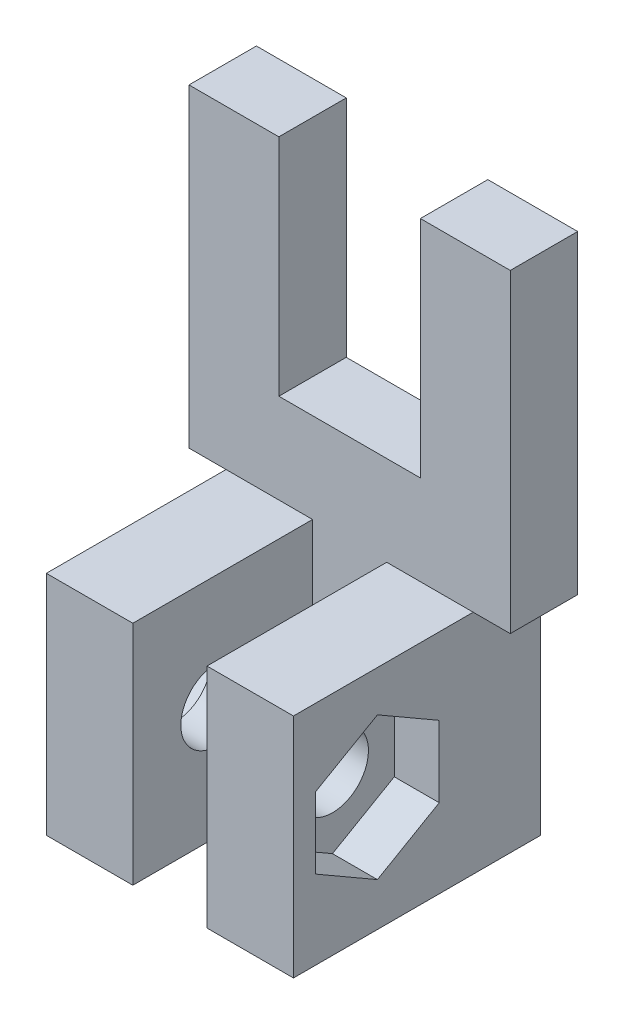
ISO-10303-21;
HEADER;
FILE_DESCRIPTION(('STEP AP214'),'2;1');
FILE_NAME('part.step','',(''),(''),'','','');
FILE_SCHEMA(('AUTOMOTIVE_DESIGN { 1 0 10303 214 1 1 1 1 }'));
ENDSEC;
DATA;
#1=APPLICATION_CONTEXT('core data for automotive mechanical design processes');
#2=APPLICATION_PROTOCOL_DEFINITION('international standard','automotive_design',2000,#1);
#3=PRODUCT_CONTEXT('',#1,'mechanical');
#4=PRODUCT('Part','Part','',(#3));
#5=PRODUCT_RELATED_PRODUCT_CATEGORY('part','',(#4));
#6=PRODUCT_DEFINITION_FORMATION('','',#4);
#7=PRODUCT_DEFINITION_CONTEXT('part definition',#1,'design');
#8=PRODUCT_DEFINITION('design','',#6,#7);
#9=PRODUCT_DEFINITION_SHAPE('','',#8);
#10=(LENGTH_UNIT() NAMED_UNIT(*) SI_UNIT(.MILLI.,.METRE.));
#11=(NAMED_UNIT(*) PLANE_ANGLE_UNIT() SI_UNIT($,.RADIAN.));
#12=(NAMED_UNIT(*) SI_UNIT($,.STERADIAN.) SOLID_ANGLE_UNIT());
#13=UNCERTAINTY_MEASURE_WITH_UNIT(LENGTH_MEASURE(1.E-05),#10,'distance_accuracy_value','');
#14=(GEOMETRIC_REPRESENTATION_CONTEXT(3) GLOBAL_UNCERTAINTY_ASSIGNED_CONTEXT((#13)) GLOBAL_UNIT_ASSIGNED_CONTEXT((#10,
#11,#12)) REPRESENTATION_CONTEXT('',''));
#15=CARTESIAN_POINT('',(0.,0.,0.));
#16=DIRECTION('',(0.,0.,1.));
#17=DIRECTION('',(1.,0.,0.));
#18=AXIS2_PLACEMENT_3D('',#15,#16,#17);
#19=CARTESIAN_POINT('',(-1.38691141904346E-12,-9.88835921456923,3.));
#20=DIRECTION('',(-1.,0.,0.));
#21=DIRECTION('',(0.,-1.,0.));
#22=AXIS2_PLACEMENT_3D('',#19,#20,#21);
#23=PLANE('',#22);
#24=DIRECTION('',(0.,1.,0.));
#25=VECTOR('',#24,1.);
#26=CARTESIAN_POINT('',(-1.38691141904346E-12,-9.88835921456923,0.));
#27=LINE('',#26,#25);
#28=CARTESIAN_POINT('',(0.,0.,0.));
#29=VERTEX_POINT('',#28);
#30=CARTESIAN_POINT('',(0.,10.1,0.));
#31=VERTEX_POINT('',#30);
#32=EDGE_CURVE('E396',#29,#31,#27,.T.);
#33=ORIENTED_EDGE('',*,*,#32,.F.);
#34=DIRECTION('',(0.,0.,-1.));
#35=VECTOR('',#34,1.);
#36=CARTESIAN_POINT('',(0.,0.,3.));
#37=LINE('',#36,#35);
#38=CARTESIAN_POINT('',(0.,0.,11.));
#39=VERTEX_POINT('',#38);
#40=EDGE_CURVE('E11',#39,#29,#37,.T.);
#41=ORIENTED_EDGE('',*,*,#40,.F.);
#42=DIRECTION('',(0.,-1.,0.));
#43=VECTOR('',#42,1.);
#44=CARTESIAN_POINT('',(0.,10.1,11.));
#45=LINE('',#44,#43);
#46=CARTESIAN_POINT('',(0.,10.1,11.));
#47=VERTEX_POINT('',#46);
#48=EDGE_CURVE('E341',#47,#39,#45,.T.);
#49=ORIENTED_EDGE('',*,*,#48,.F.);
#50=DIRECTION('',(0.,0.,-1.));
#51=VECTOR('',#50,1.);
#52=CARTESIAN_POINT('',(0.,10.1,11.));
#53=LINE('',#52,#51);
#54=CARTESIAN_POINT('',(0.,10.1,3.));
#55=VERTEX_POINT('',#54);
#56=EDGE_CURVE('E351',#47,#55,#53,.T.);
#57=ORIENTED_EDGE('',*,*,#56,.T.);
#58=DIRECTION('',(0.,0.,-1.));
#59=VECTOR('',#58,1.);
#60=CARTESIAN_POINT('',(0.,10.1,3.));
#61=LINE('',#60,#59);
#62=EDGE_CURVE('E430',#55,#31,#61,.T.);
#63=ORIENTED_EDGE('',*,*,#62,.T.);
#64=EDGE_LOOP('',(#33,#41,#49,#57,#63));
#65=FACE_BOUND('',#64,.T.);
#66=DIRECTION('',(0.,1.,0.));
#67=VECTOR('',#66,1.);
#68=CARTESIAN_POINT('',(0.,3.51228675972852,4.51346876245897));
#69=LINE('',#68,#67);
#70=CARTESIAN_POINT('',(0.,3.51228675972852,4.51346876245897));
#71=VERTEX_POINT('',#70);
#72=CARTESIAN_POINT('',(-2.36715337967284E-13,6.68771324027147,4.51346876245897));
#73=VERTEX_POINT('',#72);
#74=EDGE_CURVE('E266',#71,#73,#69,.T.);
#75=ORIENTED_EDGE('',*,*,#74,.T.);
#76=DIRECTION('',(0.,0.5,0.866025403784439));
#77=VECTOR('',#76,1.);
#78=CARTESIAN_POINT('',(0.,6.68771324027147,4.51346876245897));
#79=LINE('',#78,#77);
#80=CARTESIAN_POINT('',(0.,8.27542648054294,7.26346876245897));
#81=VERTEX_POINT('',#80);
#82=EDGE_CURVE('E54',#73,#81,#79,.T.);
#83=ORIENTED_EDGE('',*,*,#82,.T.);
#84=DIRECTION('',(0.,-0.5,0.866025403784438));
#85=VECTOR('',#84,1.);
#86=CARTESIAN_POINT('',(0.,8.27542648054294,7.26346876245897));
#87=LINE('',#86,#85);
#88=CARTESIAN_POINT('',(0.,6.68771324027147,10.013468762459));
#89=VERTEX_POINT('',#88);
#90=EDGE_CURVE('E251',#81,#89,#87,.T.);
#91=ORIENTED_EDGE('',*,*,#90,.T.);
#92=DIRECTION('',(0.,-1.,0.));
#93=VECTOR('',#92,1.);
#94=CARTESIAN_POINT('',(0.,6.68771324027147,10.013468762459));
#95=LINE('',#94,#93);
#96=CARTESIAN_POINT('',(0.,3.51228675972852,10.013468762459));
#97=VERTEX_POINT('',#96);
#98=EDGE_CURVE('E254',#89,#97,#95,.T.);
#99=ORIENTED_EDGE('',*,*,#98,.T.);
#100=DIRECTION('',(0.,-0.5,-0.866025403784439));
#101=VECTOR('',#100,1.);
#102=CARTESIAN_POINT('',(0.,3.51228675972852,10.013468762459));
#103=LINE('',#102,#101);
#104=CARTESIAN_POINT('',(0.,1.92457351945705,7.26346876245897));
#105=VERTEX_POINT('',#104);
#106=EDGE_CURVE('E271',#97,#105,#103,.T.);
#107=ORIENTED_EDGE('',*,*,#106,.T.);
#108=DIRECTION('',(0.,0.5,-0.866025403784438));
#109=VECTOR('',#108,1.);
#110=CARTESIAN_POINT('',(0.,1.92457351945705,7.26346876245897));
#111=LINE('',#110,#109);
#112=EDGE_CURVE('E268',#105,#71,#111,.T.);
#113=ORIENTED_EDGE('',*,*,#112,.T.);
#114=EDGE_LOOP('',(#75,#83,#91,#99,#107,#113));
#115=FACE_BOUND('',#114,.T.);
#116=ADVANCED_FACE('F37',(#65,#115),#23,.T.);
#117=CARTESIAN_POINT('',(12.651,5.09999999999999,7.26346876245897));
#118=DIRECTION('',(-1.,0.,0.));
#119=DIRECTION('',(0.,0.,1.));
#120=AXIS2_PLACEMENT_3D('',#117,#118,#119);
#121=CYLINDRICAL_SURFACE('',#120,1.6);
#122=CARTESIAN_POINT('',(3.85,5.09999999999999,7.26346876245897));
#123=DIRECTION('',(-1.,0.,0.));
#124=DIRECTION('',(0.,0.,1.));
#125=AXIS2_PLACEMENT_3D('',#122,#123,#124);
#126=CIRCLE('',#125,1.6);
#127=CARTESIAN_POINT('',(3.85,5.09999999999999,8.86346876245897));
#128=VERTEX_POINT('',#127);
#129=EDGE_CURVE('E278',#128,#128,#126,.T.);
#130=ORIENTED_EDGE('',*,*,#129,.F.);
#131=EDGE_LOOP('',(#130));
#132=FACE_BOUND('',#131,.T.);
#133=CARTESIAN_POINT('',(2.,5.09999999999999,7.26346876245897));
#134=DIRECTION('',(1.,0.,0.));
#135=DIRECTION('',(0.,1.,0.));
#136=AXIS2_PLACEMENT_3D('',#133,#134,#135);
#137=CIRCLE('',#136,1.6);
#138=CARTESIAN_POINT('',(2.,6.69999999999999,7.26346876245897));
#139=VERTEX_POINT('',#138);
#140=EDGE_CURVE('E257',#139,#139,#137,.T.);
#141=ORIENTED_EDGE('',*,*,#140,.F.);
#142=EDGE_LOOP('',(#141));
#143=FACE_BOUND('',#142,.T.);
#144=ADVANCED_FACE('F564',(#132,#143),#121,.F.);
#145=CARTESIAN_POINT('',(3.85,10.1,11.));
#146=DIRECTION('',(-1.,0.,0.));
#147=DIRECTION('',(0.,0.,1.));
#148=AXIS2_PLACEMENT_3D('',#145,#146,#147);
#149=PLANE('',#148);
#150=DIRECTION('',(0.,1.,0.));
#151=VECTOR('',#150,1.);
#152=CARTESIAN_POINT('',(3.85,10.1,3.));
#153=LINE('',#152,#151);
#154=CARTESIAN_POINT('',(3.85,0.,3.));
#155=VERTEX_POINT('',#154);
#156=CARTESIAN_POINT('',(3.85,10.1,3.));
#157=VERTEX_POINT('',#156);
#158=EDGE_CURVE('E340',#155,#157,#153,.T.);
#159=ORIENTED_EDGE('',*,*,#158,.T.);
#160=DIRECTION('',(0.,0.,-1.));
#161=VECTOR('',#160,1.);
#162=CARTESIAN_POINT('',(3.85,10.1,11.));
#163=LINE('',#162,#161);
#164=CARTESIAN_POINT('',(3.85,10.1,11.));
#165=VERTEX_POINT('',#164);
#166=EDGE_CURVE('E357',#165,#157,#163,.T.);
#167=ORIENTED_EDGE('',*,*,#166,.F.);
#168=DIRECTION('',(0.,1.,0.));
#169=VECTOR('',#168,1.);
#170=CARTESIAN_POINT('',(3.85,10.1,11.));
#171=LINE('',#170,#169);
#172=CARTESIAN_POINT('',(3.85,0.,11.));
#173=VERTEX_POINT('',#172);
#174=EDGE_CURVE('E347',#173,#165,#171,.T.);
#175=ORIENTED_EDGE('',*,*,#174,.F.);
#176=DIRECTION('',(0.,0.,-1.));
#177=VECTOR('',#176,1.);
#178=CARTESIAN_POINT('',(3.85,0.,11.));
#179=LINE('',#178,#177);
#180=EDGE_CURVE('E359',#173,#155,#179,.T.);
#181=ORIENTED_EDGE('',*,*,#180,.T.);
#182=EDGE_LOOP('',(#159,#167,#175,#181));
#183=FACE_BOUND('',#182,.T.);
#184=ORIENTED_EDGE('',*,*,#129,.T.);
#185=EDGE_LOOP('',(#184));
#186=FACE_BOUND('',#185,.T.);
#187=ADVANCED_FACE('F546',(#183,#186),#149,.F.);
#188=CARTESIAN_POINT('',(-1.65100000000002,5.1,7.26346876245897));
#189=DIRECTION('',(1.,0.,0.));
#190=DIRECTION('',(0.,1.,0.));
#191=AXIS2_PLACEMENT_3D('',#188,#189,#190);
#192=CYLINDRICAL_SURFACE('',#191,1.6);
#193=CARTESIAN_POINT('',(7.15,5.09999999999999,7.26346876245897));
#194=DIRECTION('',(1.,0.,0.));
#195=DIRECTION('',(0.,0.,-1.));
#196=AXIS2_PLACEMENT_3D('',#193,#194,#195);
#197=CIRCLE('',#196,1.6);
#198=CARTESIAN_POINT('',(7.15,5.09999999999999,5.66346876245897));
#199=VERTEX_POINT('',#198);
#200=EDGE_CURVE('E328',#199,#199,#197,.F.);
#201=ORIENTED_EDGE('',*,*,#200,.T.);
#202=EDGE_LOOP('',(#201));
#203=FACE_BOUND('',#202,.T.);
#204=CARTESIAN_POINT('',(9.,5.09999999999999,7.26346876245897));
#205=DIRECTION('',(1.,0.,0.));
#206=DIRECTION('',(0.,1.,0.));
#207=AXIS2_PLACEMENT_3D('',#204,#205,#206);
#208=CIRCLE('',#207,1.6);
#209=CARTESIAN_POINT('',(9.,6.69999999999999,7.26346876245897));
#210=VERTEX_POINT('',#209);
#211=EDGE_CURVE('E288',#210,#210,#208,.T.);
#212=ORIENTED_EDGE('',*,*,#211,.T.);
#213=EDGE_LOOP('',(#212));
#214=FACE_BOUND('',#213,.T.);
#215=ADVANCED_FACE('F573',(#203,#214),#192,.F.);
#216=CARTESIAN_POINT('',(5.49999999999999,-9.88835921456961,3.));
#217=DIRECTION('',(0.,0.,1.));
#218=DIRECTION('',(1.,0.,0.));
#219=AXIS2_PLACEMENT_3D('',#216,#217,#218);
#220=PLANE('',#219);
#221=DIRECTION('',(-1.,0.,0.));
#222=VECTOR('',#221,1.);
#223=CARTESIAN_POINT('',(0.,10.1,3.));
#224=LINE('',#223,#222);
#225=EDGE_CURVE('E345',#157,#55,#224,.T.);
#226=ORIENTED_EDGE('',*,*,#225,.F.);
#227=ORIENTED_EDGE('',*,*,#158,.F.);
#228=DIRECTION('',(1.,0.,0.));
#229=VECTOR('',#228,1.);
#230=CARTESIAN_POINT('',(5.49999999999999,0.,3.));
#231=LINE('',#230,#229);
#232=CARTESIAN_POINT('',(7.15,0.,3.));
#233=VERTEX_POINT('',#232);
#234=EDGE_CURVE('E40',#155,#233,#231,.T.);
#235=ORIENTED_EDGE('',*,*,#234,.T.);
#236=DIRECTION('',(0.,-1.,0.));
#237=VECTOR('',#236,1.);
#238=CARTESIAN_POINT('',(7.15,10.1,3.));
#239=LINE('',#238,#237);
#240=CARTESIAN_POINT('',(7.15,10.1,3.));
#241=VERTEX_POINT('',#240);
#242=EDGE_CURVE('E366',#241,#233,#239,.T.);
#243=ORIENTED_EDGE('',*,*,#242,.F.);
#244=DIRECTION('',(-1.,0.,0.));
#245=VECTOR('',#244,1.);
#246=CARTESIAN_POINT('',(11.,10.1,3.));
#247=LINE('',#246,#245);
#248=CARTESIAN_POINT('',(11.,10.1,3.));
#249=VERTEX_POINT('',#248);
#250=EDGE_CURVE('E361',#249,#241,#247,.T.);
#251=ORIENTED_EDGE('',*,*,#250,.F.);
#252=DIRECTION('',(-1.,0.,0.));
#253=VECTOR('',#252,1.);
#254=CARTESIAN_POINT('',(5.49999999999999,10.1,3.));
#255=LINE('',#254,#253);
#256=CARTESIAN_POINT('',(12.65,10.1,3.));
#257=VERTEX_POINT('',#256);
#258=EDGE_CURVE('E404',#257,#249,#255,.T.);
#259=ORIENTED_EDGE('',*,*,#258,.F.);
#260=DIRECTION('',(0.,-1.,0.));
#261=VECTOR('',#260,1.);
#262=CARTESIAN_POINT('',(12.65,-9.88835921456961,3.));
#263=LINE('',#262,#261);
#264=CARTESIAN_POINT('',(12.65,24.1,3.));
#265=VERTEX_POINT('',#264);
#266=EDGE_CURVE('E407',#265,#257,#263,.T.);
#267=ORIENTED_EDGE('',*,*,#266,.F.);
#268=DIRECTION('',(1.,0.,0.));
#269=VECTOR('',#268,1.);
#270=CARTESIAN_POINT('',(5.49999999999996,24.1,3.));
#271=LINE('',#270,#269);
#272=CARTESIAN_POINT('',(8.64999999999999,24.1,3.));
#273=VERTEX_POINT('',#272);
#274=EDGE_CURVE('E410',#273,#265,#271,.T.);
#275=ORIENTED_EDGE('',*,*,#274,.F.);
#276=DIRECTION('',(0.,1.,0.));
#277=VECTOR('',#276,1.);
#278=CARTESIAN_POINT('',(8.64999999999999,-9.88835921456961,3.));
#279=LINE('',#278,#277);
#280=CARTESIAN_POINT('',(8.64999999999999,14.1,3.));
#281=VERTEX_POINT('',#280);
#282=EDGE_CURVE('E413',#281,#273,#279,.T.);
#283=ORIENTED_EDGE('',*,*,#282,.F.);
#284=DIRECTION('',(1.,0.,0.));
#285=VECTOR('',#284,1.);
#286=CARTESIAN_POINT('',(5.49999999999999,14.1,3.));
#287=LINE('',#286,#285);
#288=CARTESIAN_POINT('',(2.34999999999999,14.1,3.));
#289=VERTEX_POINT('',#288);
#290=EDGE_CURVE('E416',#289,#281,#287,.T.);
#291=ORIENTED_EDGE('',*,*,#290,.F.);
#292=DIRECTION('',(0.,-1.,0.));
#293=VECTOR('',#292,1.);
#294=CARTESIAN_POINT('',(2.34999999999999,-9.88835921456961,3.));
#295=LINE('',#294,#293);
#296=CARTESIAN_POINT('',(2.34999999999999,24.1,3.));
#297=VERTEX_POINT('',#296);
#298=EDGE_CURVE('E419',#297,#289,#295,.T.);
#299=ORIENTED_EDGE('',*,*,#298,.F.);
#300=DIRECTION('',(1.,0.,0.));
#301=VECTOR('',#300,1.);
#302=CARTESIAN_POINT('',(5.50000000000002,24.1,3.));
#303=LINE('',#302,#301);
#304=CARTESIAN_POINT('',(-1.65000000000001,24.1,3.));
#305=VERTEX_POINT('',#304);
#306=EDGE_CURVE('E422',#305,#297,#303,.T.);
#307=ORIENTED_EDGE('',*,*,#306,.F.);
#308=DIRECTION('',(0.,1.,0.));
#309=VECTOR('',#308,1.);
#310=CARTESIAN_POINT('',(-1.65000000000001,-9.88835921456961,3.));
#311=LINE('',#310,#309);
#312=CARTESIAN_POINT('',(-1.65000000000001,10.1,3.));
#313=VERTEX_POINT('',#312);
#314=EDGE_CURVE('E425',#313,#305,#311,.T.);
#315=ORIENTED_EDGE('',*,*,#314,.F.);
#316=DIRECTION('',(-1.,0.,0.));
#317=VECTOR('',#316,1.);
#318=CARTESIAN_POINT('',(5.49999999999999,10.1,3.));
#319=LINE('',#318,#317);
#320=EDGE_CURVE('E428',#55,#313,#319,.T.);
#321=ORIENTED_EDGE('',*,*,#320,.F.);
#322=EDGE_LOOP('',(#226,#227,#235,#243,#251,#259,#267,#275,#283,#291,#299,#307,#315,#321));
#323=FACE_BOUND('',#322,.T.);
#324=ADVANCED_FACE('F499',(#323),#220,.T.);
#325=CARTESIAN_POINT('',(5.49999999999999,0.,3.));
#326=DIRECTION('',(0.,1.,0.));
#327=DIRECTION('',(0.,0.,1.));
#328=AXIS2_PLACEMENT_3D('',#325,#326,#327);
#329=PLANE('',#328);
#330=DIRECTION('',(1.,0.,0.));
#331=VECTOR('',#330,1.);
#332=CARTESIAN_POINT('',(5.49999999999999,0.,0.));
#333=LINE('',#332,#331);
#334=CARTESIAN_POINT('',(11.,0.,0.));
#335=VERTEX_POINT('',#334);
#336=EDGE_CURVE('E400',#29,#335,#333,.T.);
#337=ORIENTED_EDGE('',*,*,#336,.T.);
#338=DIRECTION('',(0.,0.,-1.));
#339=VECTOR('',#338,1.);
#340=CARTESIAN_POINT('',(11.,0.,3.));
#341=LINE('',#340,#339);
#342=CARTESIAN_POINT('',(11.,0.,11.));
#343=VERTEX_POINT('',#342);
#344=EDGE_CURVE('E46',#343,#335,#341,.T.);
#345=ORIENTED_EDGE('',*,*,#344,.F.);
#346=DIRECTION('',(1.,0.,0.));
#347=VECTOR('',#346,1.);
#348=CARTESIAN_POINT('',(11.,0.,11.));
#349=LINE('',#348,#347);
#350=CARTESIAN_POINT('',(7.15,0.,11.));
#351=VERTEX_POINT('',#350);
#352=EDGE_CURVE('E370',#351,#343,#349,.T.);
#353=ORIENTED_EDGE('',*,*,#352,.F.);
#354=DIRECTION('',(0.,0.,-1.));
#355=VECTOR('',#354,1.);
#356=CARTESIAN_POINT('',(7.15,0.,11.));
#357=LINE('',#356,#355);
#358=EDGE_CURVE('E373',#351,#233,#357,.T.);
#359=ORIENTED_EDGE('',*,*,#358,.T.);
#360=ORIENTED_EDGE('',*,*,#234,.F.);
#361=ORIENTED_EDGE('',*,*,#180,.F.);
#362=DIRECTION('',(1.,0.,0.));
#363=VECTOR('',#362,1.);
#364=CARTESIAN_POINT('',(0.,0.,11.));
#365=LINE('',#364,#363);
#366=EDGE_CURVE('E344',#39,#173,#365,.T.);
#367=ORIENTED_EDGE('',*,*,#366,.F.);
#368=ORIENTED_EDGE('',*,*,#40,.T.);
#369=EDGE_LOOP('',(#337,#345,#353,#359,#360,#361,#367,#368));
#370=FACE_BOUND('',#369,.T.);
#371=ADVANCED_FACE('F548',(#370),#329,.F.);
#372=CARTESIAN_POINT('',(11.,-9.88835921456962,3.));
#373=DIRECTION('',(-1.,0.,0.));
#374=DIRECTION('',(0.,-1.,0.));
#375=AXIS2_PLACEMENT_3D('',#372,#373,#374);
#376=PLANE('',#375);
#377=DIRECTION('',(0.,-0.5,0.866025403784438));
#378=VECTOR('',#377,1.);
#379=CARTESIAN_POINT('',(11.,8.27542648054293,7.26346876245897));
#380=LINE('',#379,#378);
#381=CARTESIAN_POINT('',(11.,8.27542648054294,7.26346876245897));
#382=VERTEX_POINT('',#381);
#383=CARTESIAN_POINT('',(11.,6.68771324027146,10.013468762459));
#384=VERTEX_POINT('',#383);
#385=EDGE_CURVE('E312',#382,#384,#380,.T.);
#386=ORIENTED_EDGE('',*,*,#385,.F.);
#387=DIRECTION('',(0.,0.5,0.866025403784439));
#388=VECTOR('',#387,1.);
#389=CARTESIAN_POINT('',(11.,6.68771324027146,4.51346876245897));
#390=LINE('',#389,#388);
#391=CARTESIAN_POINT('',(11.,6.68771324027146,4.51346876245897));
#392=VERTEX_POINT('',#391);
#393=EDGE_CURVE('E62',#392,#382,#390,.T.);
#394=ORIENTED_EDGE('',*,*,#393,.F.);
#395=DIRECTION('',(0.,1.,0.));
#396=VECTOR('',#395,1.);
#397=CARTESIAN_POINT('',(11.,3.51228675972852,4.51346876245897));
#398=LINE('',#397,#396);
#399=CARTESIAN_POINT('',(11.,3.51228675972852,4.51346876245897));
#400=VERTEX_POINT('',#399);
#401=EDGE_CURVE('E295',#400,#392,#398,.T.);
#402=ORIENTED_EDGE('',*,*,#401,.F.);
#403=DIRECTION('',(0.,0.5,-0.866025403784438));
#404=VECTOR('',#403,1.);
#405=CARTESIAN_POINT('',(11.,1.92457351945705,7.26346876245897));
#406=LINE('',#405,#404);
#407=CARTESIAN_POINT('',(11.,1.92457351945705,7.26346876245897));
#408=VERTEX_POINT('',#407);
#409=EDGE_CURVE('E321',#408,#400,#406,.T.);
#410=ORIENTED_EDGE('',*,*,#409,.F.);
#411=DIRECTION('',(0.,-0.5,-0.866025403784439));
#412=VECTOR('',#411,1.);
#413=CARTESIAN_POINT('',(11.,3.51228675972852,10.013468762459));
#414=LINE('',#413,#412);
#415=CARTESIAN_POINT('',(11.,3.51228675972852,10.013468762459));
#416=VERTEX_POINT('',#415);
#417=EDGE_CURVE('E318',#416,#408,#414,.T.);
#418=ORIENTED_EDGE('',*,*,#417,.F.);
#419=DIRECTION('',(0.,-1.,0.));
#420=VECTOR('',#419,1.);
#421=CARTESIAN_POINT('',(11.,6.68771324027146,10.013468762459));
#422=LINE('',#421,#420);
#423=EDGE_CURVE('E315',#384,#416,#422,.T.);
#424=ORIENTED_EDGE('',*,*,#423,.F.);
#425=EDGE_LOOP('',(#386,#394,#402,#410,#418,#424));
#426=FACE_BOUND('',#425,.T.);
#427=DIRECTION('',(0.,1.,0.));
#428=VECTOR('',#427,1.);
#429=CARTESIAN_POINT('',(11.,-9.88835921456962,0.));
#430=LINE('',#429,#428);
#431=CARTESIAN_POINT('',(11.,10.1,0.));
#432=VERTEX_POINT('',#431);
#433=EDGE_CURVE('E433',#335,#432,#430,.T.);
#434=ORIENTED_EDGE('',*,*,#433,.T.);
#435=DIRECTION('',(0.,0.,-1.));
#436=VECTOR('',#435,1.);
#437=CARTESIAN_POINT('',(11.,10.1,3.));
#438=LINE('',#437,#436);
#439=EDGE_CURVE('E480',#249,#432,#438,.T.);
#440=ORIENTED_EDGE('',*,*,#439,.F.);
#441=DIRECTION('',(0.,0.,-1.));
#442=VECTOR('',#441,1.);
#443=CARTESIAN_POINT('',(11.,10.1,11.));
#444=LINE('',#443,#442);
#445=CARTESIAN_POINT('',(11.,10.1,11.));
#446=VERTEX_POINT('',#445);
#447=EDGE_CURVE('E391',#446,#249,#444,.T.);
#448=ORIENTED_EDGE('',*,*,#447,.F.);
#449=DIRECTION('',(0.,1.,0.));
#450=VECTOR('',#449,1.);
#451=CARTESIAN_POINT('',(11.,10.1,11.));
#452=LINE('',#451,#450);
#453=EDGE_CURVE('E362',#343,#446,#452,.T.);
#454=ORIENTED_EDGE('',*,*,#453,.F.);
#455=ORIENTED_EDGE('',*,*,#344,.T.);
#456=EDGE_LOOP('',(#434,#440,#448,#454,#455));
#457=FACE_BOUND('',#456,.T.);
#458=ADVANCED_FACE('F485',(#426,#457),#376,.F.);
#459=CARTESIAN_POINT('',(5.49999999999999,10.1,3.));
#460=DIRECTION('',(0.,-1.,0.));
#461=DIRECTION('',(0.,0.,-1.));
#462=AXIS2_PLACEMENT_3D('',#459,#460,#461);
#463=PLANE('',#462);
#464=DIRECTION('',(-1.,0.,0.));
#465=VECTOR('',#464,1.);
#466=CARTESIAN_POINT('',(5.49999999999999,10.1,0.));
#467=LINE('',#466,#465);
#468=CARTESIAN_POINT('',(12.65,10.1,0.));
#469=VERTEX_POINT('',#468);
#470=EDGE_CURVE('E436',#469,#432,#467,.T.);
#471=ORIENTED_EDGE('',*,*,#470,.F.);
#472=DIRECTION('',(0.,0.,-1.));
#473=VECTOR('',#472,1.);
#474=CARTESIAN_POINT('',(12.65,10.1,3.));
#475=LINE('',#474,#473);
#476=EDGE_CURVE('E478',#257,#469,#475,.T.);
#477=ORIENTED_EDGE('',*,*,#476,.F.);
#478=ORIENTED_EDGE('',*,*,#258,.T.);
#479=ORIENTED_EDGE('',*,*,#439,.T.);
#480=EDGE_LOOP('',(#471,#477,#478,#479));
#481=FACE_BOUND('',#480,.T.);
#482=ADVANCED_FACE('F494',(#481),#463,.T.);
#483=CARTESIAN_POINT('',(12.65,-9.88835921456961,3.));
#484=DIRECTION('',(1.,0.,0.));
#485=DIRECTION('',(0.,0.,-1.));
#486=AXIS2_PLACEMENT_3D('',#483,#484,#485);
#487=PLANE('',#486);
#488=DIRECTION('',(0.,-1.,0.));
#489=VECTOR('',#488,1.);
#490=CARTESIAN_POINT('',(12.65,-9.88835921456961,0.));
#491=LINE('',#490,#489);
#492=CARTESIAN_POINT('',(12.65,24.1,0.));
#493=VERTEX_POINT('',#492);
#494=EDGE_CURVE('E439',#493,#469,#491,.T.);
#495=ORIENTED_EDGE('',*,*,#494,.F.);
#496=DIRECTION('',(0.,0.,-1.));
#497=VECTOR('',#496,1.);
#498=CARTESIAN_POINT('',(12.65,24.1,3.));
#499=LINE('',#498,#497);
#500=EDGE_CURVE('E476',#265,#493,#499,.T.);
#501=ORIENTED_EDGE('',*,*,#500,.F.);
#502=ORIENTED_EDGE('',*,*,#266,.T.);
#503=ORIENTED_EDGE('',*,*,#476,.T.);
#504=EDGE_LOOP('',(#495,#501,#502,#503));
#505=FACE_BOUND('',#504,.T.);
#506=ADVANCED_FACE('F502',(#505),#487,.T.);
#507=CARTESIAN_POINT('',(5.49999999999996,24.1,3.));
#508=DIRECTION('',(0.,1.,0.));
#509=DIRECTION('',(-1.,0.,0.));
#510=AXIS2_PLACEMENT_3D('',#507,#508,#509);
#511=PLANE('',#510);
#512=DIRECTION('',(1.,0.,0.));
#513=VECTOR('',#512,1.);
#514=CARTESIAN_POINT('',(5.49999999999996,24.1,0.));
#515=LINE('',#514,#513);
#516=CARTESIAN_POINT('',(8.64999999999999,24.1,0.));
#517=VERTEX_POINT('',#516);
#518=EDGE_CURVE('E442',#517,#493,#515,.T.);
#519=ORIENTED_EDGE('',*,*,#518,.F.);
#520=DIRECTION('',(0.,0.,-1.));
#521=VECTOR('',#520,1.);
#522=CARTESIAN_POINT('',(8.64999999999999,24.1,3.));
#523=LINE('',#522,#521);
#524=EDGE_CURVE('E474',#273,#517,#523,.T.);
#525=ORIENTED_EDGE('',*,*,#524,.F.);
#526=ORIENTED_EDGE('',*,*,#274,.T.);
#527=ORIENTED_EDGE('',*,*,#500,.T.);
#528=EDGE_LOOP('',(#519,#525,#526,#527));
#529=FACE_BOUND('',#528,.T.);
#530=ADVANCED_FACE('F505',(#529),#511,.T.);
#531=CARTESIAN_POINT('',(8.64999999999999,-9.88835921456961,3.));
#532=DIRECTION('',(-1.,0.,0.));
#533=DIRECTION('',(0.,0.,1.));
#534=AXIS2_PLACEMENT_3D('',#531,#532,#533);
#535=PLANE('',#534);
#536=DIRECTION('',(0.,1.,0.));
#537=VECTOR('',#536,1.);
#538=CARTESIAN_POINT('',(8.64999999999999,-9.88835921456961,0.));
#539=LINE('',#538,#537);
#540=CARTESIAN_POINT('',(8.64999999999999,14.1,0.));
#541=VERTEX_POINT('',#540);
#542=EDGE_CURVE('E445',#541,#517,#539,.T.);
#543=ORIENTED_EDGE('',*,*,#542,.F.);
#544=DIRECTION('',(0.,0.,-1.));
#545=VECTOR('',#544,1.);
#546=CARTESIAN_POINT('',(8.64999999999999,14.1,3.));
#547=LINE('',#546,#545);
#548=EDGE_CURVE('E472',#281,#541,#547,.T.);
#549=ORIENTED_EDGE('',*,*,#548,.F.);
#550=ORIENTED_EDGE('',*,*,#282,.T.);
#551=ORIENTED_EDGE('',*,*,#524,.T.);
#552=EDGE_LOOP('',(#543,#549,#550,#551));
#553=FACE_BOUND('',#552,.T.);
#554=ADVANCED_FACE('F510',(#553),#535,.T.);
#555=CARTESIAN_POINT('',(5.49999999999999,14.1,3.));
#556=DIRECTION('',(0.,1.,0.));
#557=DIRECTION('',(0.,0.,1.));
#558=AXIS2_PLACEMENT_3D('',#555,#556,#557);
#559=PLANE('',#558);
#560=DIRECTION('',(1.,0.,0.));
#561=VECTOR('',#560,1.);
#562=CARTESIAN_POINT('',(5.49999999999999,14.1,0.));
#563=LINE('',#562,#561);
#564=CARTESIAN_POINT('',(2.34999999999999,14.1,0.));
#565=VERTEX_POINT('',#564);
#566=EDGE_CURVE('E448',#565,#541,#563,.T.);
#567=ORIENTED_EDGE('',*,*,#566,.F.);
#568=DIRECTION('',(0.,0.,-1.));
#569=VECTOR('',#568,1.);
#570=CARTESIAN_POINT('',(2.34999999999999,14.1,3.));
#571=LINE('',#570,#569);
#572=EDGE_CURVE('E470',#289,#565,#571,.T.);
#573=ORIENTED_EDGE('',*,*,#572,.F.);
#574=ORIENTED_EDGE('',*,*,#290,.T.);
#575=ORIENTED_EDGE('',*,*,#548,.T.);
#576=EDGE_LOOP('',(#567,#573,#574,#575));
#577=FACE_BOUND('',#576,.T.);
#578=ADVANCED_FACE('F513',(#577),#559,.T.);
#579=CARTESIAN_POINT('',(2.34999999999999,-9.88835921456961,3.));
#580=DIRECTION('',(1.,0.,0.));
#581=DIRECTION('',(0.,1.,0.));
#582=AXIS2_PLACEMENT_3D('',#579,#580,#581);
#583=PLANE('',#582);
#584=DIRECTION('',(0.,-1.,0.));
#585=VECTOR('',#584,1.);
#586=CARTESIAN_POINT('',(2.34999999999999,-9.88835921456961,0.));
#587=LINE('',#586,#585);
#588=CARTESIAN_POINT('',(2.34999999999999,24.1,0.));
#589=VERTEX_POINT('',#588);
#590=EDGE_CURVE('E451',#589,#565,#587,.T.);
#591=ORIENTED_EDGE('',*,*,#590,.F.);
#592=DIRECTION('',(0.,0.,-1.));
#593=VECTOR('',#592,1.);
#594=CARTESIAN_POINT('',(2.34999999999999,24.1,3.));
#595=LINE('',#594,#593);
#596=EDGE_CURVE('E468',#297,#589,#595,.T.);
#597=ORIENTED_EDGE('',*,*,#596,.F.);
#598=ORIENTED_EDGE('',*,*,#298,.T.);
#599=ORIENTED_EDGE('',*,*,#572,.T.);
#600=EDGE_LOOP('',(#591,#597,#598,#599));
#601=FACE_BOUND('',#600,.T.);
#602=ADVANCED_FACE('F518',(#601),#583,.T.);
#603=CARTESIAN_POINT('',(5.50000000000002,24.1,3.));
#604=DIRECTION('',(0.,1.,0.));
#605=DIRECTION('',(-1.,0.,0.));
#606=AXIS2_PLACEMENT_3D('',#603,#604,#605);
#607=PLANE('',#606);
#608=DIRECTION('',(1.,0.,0.));
#609=VECTOR('',#608,1.);
#610=CARTESIAN_POINT('',(5.50000000000002,24.1,0.));
#611=LINE('',#610,#609);
#612=CARTESIAN_POINT('',(-1.65000000000001,24.1,0.));
#613=VERTEX_POINT('',#612);
#614=EDGE_CURVE('E454',#613,#589,#611,.T.);
#615=ORIENTED_EDGE('',*,*,#614,.F.);
#616=DIRECTION('',(0.,0.,-1.));
#617=VECTOR('',#616,1.);
#618=CARTESIAN_POINT('',(-1.65000000000001,24.1,3.));
#619=LINE('',#618,#617);
#620=EDGE_CURVE('E466',#305,#613,#619,.T.);
#621=ORIENTED_EDGE('',*,*,#620,.F.);
#622=ORIENTED_EDGE('',*,*,#306,.T.);
#623=ORIENTED_EDGE('',*,*,#596,.T.);
#624=EDGE_LOOP('',(#615,#621,#622,#623));
#625=FACE_BOUND('',#624,.T.);
#626=ADVANCED_FACE('F521',(#625),#607,.T.);
#627=CARTESIAN_POINT('',(-1.65000000000001,-9.88835921456961,3.));
#628=DIRECTION('',(-1.,0.,0.));
#629=DIRECTION('',(0.,0.,1.));
#630=AXIS2_PLACEMENT_3D('',#627,#628,#629);
#631=PLANE('',#630);
#632=DIRECTION('',(0.,1.,0.));
#633=VECTOR('',#632,1.);
#634=CARTESIAN_POINT('',(-1.65000000000001,-9.88835921456961,0.));
#635=LINE('',#634,#633);
#636=CARTESIAN_POINT('',(-1.65000000000001,10.1,0.));
#637=VERTEX_POINT('',#636);
#638=EDGE_CURVE('E457',#637,#613,#635,.T.);
#639=ORIENTED_EDGE('',*,*,#638,.F.);
#640=DIRECTION('',(0.,0.,-1.));
#641=VECTOR('',#640,1.);
#642=CARTESIAN_POINT('',(-1.65000000000001,10.1,3.));
#643=LINE('',#642,#641);
#644=EDGE_CURVE('E464',#313,#637,#643,.T.);
#645=ORIENTED_EDGE('',*,*,#644,.F.);
#646=ORIENTED_EDGE('',*,*,#314,.T.);
#647=ORIENTED_EDGE('',*,*,#620,.T.);
#648=EDGE_LOOP('',(#639,#645,#646,#647));
#649=FACE_BOUND('',#648,.T.);
#650=ADVANCED_FACE('F526',(#649),#631,.T.);
#651=CARTESIAN_POINT('',(5.49999999999999,10.1,3.));
#652=DIRECTION('',(0.,-1.,0.));
#653=DIRECTION('',(0.,0.,-1.));
#654=AXIS2_PLACEMENT_3D('',#651,#652,#653);
#655=PLANE('',#654);
#656=DIRECTION('',(-1.,0.,0.));
#657=VECTOR('',#656,1.);
#658=CARTESIAN_POINT('',(5.49999999999999,10.1,0.));
#659=LINE('',#658,#657);
#660=EDGE_CURVE('E460',#31,#637,#659,.T.);
#661=ORIENTED_EDGE('',*,*,#660,.F.);
#662=ORIENTED_EDGE('',*,*,#62,.F.);
#663=ORIENTED_EDGE('',*,*,#320,.T.);
#664=ORIENTED_EDGE('',*,*,#644,.T.);
#665=EDGE_LOOP('',(#661,#662,#663,#664));
#666=FACE_BOUND('',#665,.T.);
#667=ADVANCED_FACE('F529',(#666),#655,.T.);
#668=CARTESIAN_POINT('',(5.49999999999999,-9.88835921456961,0.));
#669=DIRECTION('',(0.,0.,1.));
#670=DIRECTION('',(1.,0.,0.));
#671=AXIS2_PLACEMENT_3D('',#668,#669,#670);
#672=PLANE('',#671);
#673=ORIENTED_EDGE('',*,*,#32,.T.);
#674=ORIENTED_EDGE('',*,*,#660,.T.);
#675=ORIENTED_EDGE('',*,*,#638,.T.);
#676=ORIENTED_EDGE('',*,*,#614,.T.);
#677=ORIENTED_EDGE('',*,*,#590,.T.);
#678=ORIENTED_EDGE('',*,*,#566,.T.);
#679=ORIENTED_EDGE('',*,*,#542,.T.);
#680=ORIENTED_EDGE('',*,*,#518,.T.);
#681=ORIENTED_EDGE('',*,*,#494,.T.);
#682=ORIENTED_EDGE('',*,*,#470,.T.);
#683=ORIENTED_EDGE('',*,*,#433,.F.);
#684=ORIENTED_EDGE('',*,*,#336,.F.);
#685=EDGE_LOOP('',(#673,#674,#675,#676,#677,#678,#679,#680,#681,#682,#683,#684));
#686=FACE_BOUND('',#685,.T.);
#687=ADVANCED_FACE('F489',(#686),#672,.F.);
#688=CARTESIAN_POINT('',(11.,10.1,11.));
#689=DIRECTION('',(0.,-1.,0.));
#690=DIRECTION('',(0.,0.,-1.));
#691=AXIS2_PLACEMENT_3D('',#688,#689,#690);
#692=PLANE('',#691);
#693=ORIENTED_EDGE('',*,*,#250,.T.);
#694=DIRECTION('',(0.,0.,-1.));
#695=VECTOR('',#694,1.);
#696=CARTESIAN_POINT('',(7.15,10.1,11.));
#697=LINE('',#696,#695);
#698=CARTESIAN_POINT('',(7.15,10.1,11.));
#699=VERTEX_POINT('',#698);
#700=EDGE_CURVE('E378',#699,#241,#697,.T.);
#701=ORIENTED_EDGE('',*,*,#700,.F.);
#702=DIRECTION('',(-1.,0.,0.));
#703=VECTOR('',#702,1.);
#704=CARTESIAN_POINT('',(11.,10.1,11.));
#705=LINE('',#704,#703);
#706=EDGE_CURVE('E365',#446,#699,#705,.T.);
#707=ORIENTED_EDGE('',*,*,#706,.F.);
#708=ORIENTED_EDGE('',*,*,#447,.T.);
#709=EDGE_LOOP('',(#693,#701,#707,#708));
#710=FACE_BOUND('',#709,.T.);
#711=ADVANCED_FACE('F552',(#710),#692,.F.);
#712=CARTESIAN_POINT('',(7.15,10.1,11.));
#713=DIRECTION('',(1.,0.,0.));
#714=DIRECTION('',(0.,0.,-1.));
#715=AXIS2_PLACEMENT_3D('',#712,#713,#714);
#716=PLANE('',#715);
#717=ORIENTED_EDGE('',*,*,#200,.F.);
#718=EDGE_LOOP('',(#717));
#719=FACE_BOUND('',#718,.T.);
#720=ORIENTED_EDGE('',*,*,#242,.T.);
#721=ORIENTED_EDGE('',*,*,#358,.F.);
#722=DIRECTION('',(0.,-1.,0.));
#723=VECTOR('',#722,1.);
#724=CARTESIAN_POINT('',(7.15,10.1,11.));
#725=LINE('',#724,#723);
#726=EDGE_CURVE('E368',#699,#351,#725,.T.);
#727=ORIENTED_EDGE('',*,*,#726,.F.);
#728=ORIENTED_EDGE('',*,*,#700,.T.);
#729=EDGE_LOOP('',(#720,#721,#727,#728));
#730=FACE_BOUND('',#729,.T.);
#731=ADVANCED_FACE('F549',(#719,#730),#716,.F.);
#732=CARTESIAN_POINT('',(11.,0.,11.));
#733=DIRECTION('',(0.,0.,-1.));
#734=DIRECTION('',(-1.,0.,0.));
#735=AXIS2_PLACEMENT_3D('',#732,#733,#734);
#736=PLANE('',#735);
#737=ORIENTED_EDGE('',*,*,#453,.T.);
#738=ORIENTED_EDGE('',*,*,#706,.T.);
#739=ORIENTED_EDGE('',*,*,#726,.T.);
#740=ORIENTED_EDGE('',*,*,#352,.T.);
#741=EDGE_LOOP('',(#737,#738,#739,#740));
#742=FACE_BOUND('',#741,.T.);
#743=ADVANCED_FACE('F551',(#742),#736,.F.);
#744=CARTESIAN_POINT('',(0.,10.1,11.));
#745=DIRECTION('',(0.,-1.,0.));
#746=DIRECTION('',(1.,0.,0.));
#747=AXIS2_PLACEMENT_3D('',#744,#745,#746);
#748=PLANE('',#747);
#749=ORIENTED_EDGE('',*,*,#225,.T.);
#750=ORIENTED_EDGE('',*,*,#56,.F.);
#751=DIRECTION('',(-1.,0.,0.));
#752=VECTOR('',#751,1.);
#753=CARTESIAN_POINT('',(0.,10.1,11.));
#754=LINE('',#753,#752);
#755=EDGE_CURVE('E349',#165,#47,#754,.T.);
#756=ORIENTED_EDGE('',*,*,#755,.F.);
#757=ORIENTED_EDGE('',*,*,#166,.T.);
#758=EDGE_LOOP('',(#749,#750,#756,#757));
#759=FACE_BOUND('',#758,.T.);
#760=ADVANCED_FACE('F534',(#759),#748,.F.);
#761=CARTESIAN_POINT('',(0.,0.,11.));
#762=DIRECTION('',(0.,0.,1.));
#763=DIRECTION('',(1.,0.,0.));
#764=AXIS2_PLACEMENT_3D('',#761,#762,#763);
#765=PLANE('',#764);
#766=ORIENTED_EDGE('',*,*,#48,.T.);
#767=ORIENTED_EDGE('',*,*,#366,.T.);
#768=ORIENTED_EDGE('',*,*,#174,.T.);
#769=ORIENTED_EDGE('',*,*,#755,.T.);
#770=EDGE_LOOP('',(#766,#767,#768,#769));
#771=FACE_BOUND('',#770,.T.);
#772=ADVANCED_FACE('F542',(#771),#765,.T.);
#773=CARTESIAN_POINT('',(9.,6.68771324027146,4.51346876245897));
#774=DIRECTION('',(0.,0.866025403784439,-0.5));
#775=DIRECTION('',(0.,0.5,0.866025403784439));
#776=AXIS2_PLACEMENT_3D('',#773,#774,#775);
#777=PLANE('',#776);
#778=ORIENTED_EDGE('',*,*,#393,.T.);
#779=DIRECTION('',(1.,0.,0.));
#780=VECTOR('',#779,1.);
#781=CARTESIAN_POINT('',(9.,8.27542648054294,7.26346876245897));
#782=LINE('',#781,#780);
#783=CARTESIAN_POINT('',(9.,8.27542648054294,7.26346876245897));
#784=VERTEX_POINT('',#783);
#785=EDGE_CURVE('E310',#784,#382,#782,.T.);
#786=ORIENTED_EDGE('',*,*,#785,.F.);
#787=DIRECTION('',(0.,0.5,0.866025403784439));
#788=VECTOR('',#787,1.);
#789=CARTESIAN_POINT('',(9.,6.68771324027146,4.51346876245897));
#790=LINE('',#789,#788);
#791=CARTESIAN_POINT('',(9.,6.68771324027146,4.51346876245897));
#792=VERTEX_POINT('',#791);
#793=EDGE_CURVE('E291',#792,#784,#790,.T.);
#794=ORIENTED_EDGE('',*,*,#793,.F.);
#795=DIRECTION('',(1.,0.,0.));
#796=VECTOR('',#795,1.);
#797=CARTESIAN_POINT('',(9.,6.68771324027146,4.51346876245897));
#798=LINE('',#797,#796);
#799=EDGE_CURVE('E326',#792,#392,#798,.T.);
#800=ORIENTED_EDGE('',*,*,#799,.T.);
#801=EDGE_LOOP('',(#778,#786,#794,#800));
#802=FACE_BOUND('',#801,.T.);
#803=ADVANCED_FACE('F589',(#802),#777,.F.);
#804=CARTESIAN_POINT('',(8.99999999999999,3.51228675972852,4.51346876245897));
#805=DIRECTION('',(0.,0.,-1.));
#806=DIRECTION('',(0.,1.,0.));
#807=AXIS2_PLACEMENT_3D('',#804,#805,#806);
#808=PLANE('',#807);
#809=ORIENTED_EDGE('',*,*,#401,.T.);
#810=ORIENTED_EDGE('',*,*,#799,.F.);
#811=DIRECTION('',(0.,1.,0.));
#812=VECTOR('',#811,1.);
#813=CARTESIAN_POINT('',(8.99999999999999,3.51228675972852,4.51346876245897));
#814=LINE('',#813,#812);
#815=CARTESIAN_POINT('',(8.99999999999999,3.51228675972852,4.51346876245897));
#816=VERTEX_POINT('',#815);
#817=EDGE_CURVE('E307',#816,#792,#814,.T.);
#818=ORIENTED_EDGE('',*,*,#817,.F.);
#819=DIRECTION('',(1.,0.,0.));
#820=VECTOR('',#819,1.);
#821=CARTESIAN_POINT('',(8.99999999999999,3.51228675972852,4.51346876245897));
#822=LINE('',#821,#820);
#823=EDGE_CURVE('E329',#816,#400,#822,.T.);
#824=ORIENTED_EDGE('',*,*,#823,.T.);
#825=EDGE_LOOP('',(#809,#810,#818,#824));
#826=FACE_BOUND('',#825,.T.);
#827=ADVANCED_FACE('F585',(#826),#808,.F.);
#828=CARTESIAN_POINT('',(8.99999999999999,1.92457351945705,7.26346876245897));
#829=DIRECTION('',(0.,-0.866025403784438,-0.5));
#830=DIRECTION('',(0.,0.5,-0.866025403784438));
#831=AXIS2_PLACEMENT_3D('',#828,#829,#830);
#832=PLANE('',#831);
#833=ORIENTED_EDGE('',*,*,#409,.T.);
#834=ORIENTED_EDGE('',*,*,#823,.F.);
#835=DIRECTION('',(0.,0.5,-0.866025403784438));
#836=VECTOR('',#835,1.);
#837=CARTESIAN_POINT('',(8.99999999999999,1.92457351945705,7.26346876245897));
#838=LINE('',#837,#836);
#839=CARTESIAN_POINT('',(8.99999999999999,1.92457351945705,7.26346876245897));
#840=VERTEX_POINT('',#839);
#841=EDGE_CURVE('E304',#840,#816,#838,.T.);
#842=ORIENTED_EDGE('',*,*,#841,.F.);
#843=DIRECTION('',(1.,0.,0.));
#844=VECTOR('',#843,1.);
#845=CARTESIAN_POINT('',(8.99999999999999,1.92457351945705,7.26346876245897));
#846=LINE('',#845,#844);
#847=EDGE_CURVE('E331',#840,#408,#846,.T.);
#848=ORIENTED_EDGE('',*,*,#847,.T.);
#849=EDGE_LOOP('',(#833,#834,#842,#848));
#850=FACE_BOUND('',#849,.T.);
#851=ADVANCED_FACE('F588',(#850),#832,.F.);
#852=CARTESIAN_POINT('',(8.99999999999999,3.51228675972852,10.013468762459));
#853=DIRECTION('',(0.,-0.866025403784439,0.5));
#854=DIRECTION('',(0.,-0.5,-0.866025403784439));
#855=AXIS2_PLACEMENT_3D('',#852,#853,#854);
#856=PLANE('',#855);
#857=ORIENTED_EDGE('',*,*,#417,.T.);
#858=ORIENTED_EDGE('',*,*,#847,.F.);
#859=DIRECTION('',(0.,-0.5,-0.866025403784439));
#860=VECTOR('',#859,1.);
#861=CARTESIAN_POINT('',(8.99999999999999,3.51228675972852,10.013468762459));
#862=LINE('',#861,#860);
#863=CARTESIAN_POINT('',(8.99999999999999,3.51228675972852,10.013468762459));
#864=VERTEX_POINT('',#863);
#865=EDGE_CURVE('E301',#864,#840,#862,.T.);
#866=ORIENTED_EDGE('',*,*,#865,.F.);
#867=DIRECTION('',(1.,0.,0.));
#868=VECTOR('',#867,1.);
#869=CARTESIAN_POINT('',(8.99999999999999,3.51228675972852,10.013468762459));
#870=LINE('',#869,#868);
#871=EDGE_CURVE('E333',#864,#416,#870,.T.);
#872=ORIENTED_EDGE('',*,*,#871,.T.);
#873=EDGE_LOOP('',(#857,#858,#866,#872));
#874=FACE_BOUND('',#873,.T.);
#875=ADVANCED_FACE('F593',(#874),#856,.F.);
#876=CARTESIAN_POINT('',(9.,6.68771324027146,10.013468762459));
#877=DIRECTION('',(0.,0.,1.));
#878=DIRECTION('',(1.,0.,0.));
#879=AXIS2_PLACEMENT_3D('',#876,#877,#878);
#880=PLANE('',#879);
#881=ORIENTED_EDGE('',*,*,#423,.T.);
#882=ORIENTED_EDGE('',*,*,#871,.F.);
#883=DIRECTION('',(0.,-1.,0.));
#884=VECTOR('',#883,1.);
#885=CARTESIAN_POINT('',(9.,6.68771324027146,10.013468762459));
#886=LINE('',#885,#884);
#887=CARTESIAN_POINT('',(9.,6.68771324027146,10.013468762459));
#888=VERTEX_POINT('',#887);
#889=EDGE_CURVE('E298',#888,#864,#886,.T.);
#890=ORIENTED_EDGE('',*,*,#889,.F.);
#891=DIRECTION('',(1.,0.,0.));
#892=VECTOR('',#891,1.);
#893=CARTESIAN_POINT('',(9.,6.68771324027146,10.013468762459));
#894=LINE('',#893,#892);
#895=EDGE_CURVE('E335',#888,#384,#894,.T.);
#896=ORIENTED_EDGE('',*,*,#895,.T.);
#897=EDGE_LOOP('',(#881,#882,#890,#896));
#898=FACE_BOUND('',#897,.T.);
#899=ADVANCED_FACE('F597',(#898),#880,.F.);
#900=CARTESIAN_POINT('',(9.,8.27542648054294,7.26346876245897));
#901=DIRECTION('',(0.,0.866025403784438,0.5));
#902=DIRECTION('',(0.,-0.5,0.866025403784438));
#903=AXIS2_PLACEMENT_3D('',#900,#901,#902);
#904=PLANE('',#903);
#905=ORIENTED_EDGE('',*,*,#385,.T.);
#906=ORIENTED_EDGE('',*,*,#895,.F.);
#907=DIRECTION('',(0.,-0.5,0.866025403784438));
#908=VECTOR('',#907,1.);
#909=CARTESIAN_POINT('',(9.,8.27542648054294,7.26346876245897));
#910=LINE('',#909,#908);
#911=EDGE_CURVE('E294',#784,#888,#910,.T.);
#912=ORIENTED_EDGE('',*,*,#911,.F.);
#913=ORIENTED_EDGE('',*,*,#785,.T.);
#914=EDGE_LOOP('',(#905,#906,#912,#913));
#915=FACE_BOUND('',#914,.T.);
#916=ADVANCED_FACE('F583',(#915),#904,.F.);
#917=CARTESIAN_POINT('',(9.,8.27542648054294,7.26346876245897));
#918=DIRECTION('',(1.,0.,0.));
#919=DIRECTION('',(0.,0.,-1.));
#920=AXIS2_PLACEMENT_3D('',#917,#918,#919);
#921=PLANE('',#920);
#922=ORIENTED_EDGE('',*,*,#211,.F.);
#923=EDGE_LOOP('',(#922));
#924=FACE_BOUND('',#923,.T.);
#925=ORIENTED_EDGE('',*,*,#793,.T.);
#926=ORIENTED_EDGE('',*,*,#911,.T.);
#927=ORIENTED_EDGE('',*,*,#889,.T.);
#928=ORIENTED_EDGE('',*,*,#865,.T.);
#929=ORIENTED_EDGE('',*,*,#841,.T.);
#930=ORIENTED_EDGE('',*,*,#817,.T.);
#931=EDGE_LOOP('',(#925,#926,#927,#928,#929,#930));
#932=FACE_BOUND('',#931,.T.);
#933=ADVANCED_FACE('F580',(#924,#932),#921,.T.);
#934=CARTESIAN_POINT('',(2.,8.27542648054294,7.26346876245897));
#935=DIRECTION('',(-1.,0.,0.));
#936=DIRECTION('',(0.,0.,-1.));
#937=AXIS2_PLACEMENT_3D('',#934,#935,#936);
#938=PLANE('',#937);
#939=DIRECTION('',(0.,0.5,0.866025403784439));
#940=VECTOR('',#939,1.);
#941=CARTESIAN_POINT('',(2.,6.68771324027147,4.51346876245897));
#942=LINE('',#941,#940);
#943=CARTESIAN_POINT('',(2.,6.68771324027147,4.51346876245897));
#944=VERTEX_POINT('',#943);
#945=CARTESIAN_POINT('',(2.,8.27542648054294,7.26346876245897));
#946=VERTEX_POINT('',#945);
#947=EDGE_CURVE('E241',#944,#946,#942,.T.);
#948=ORIENTED_EDGE('',*,*,#947,.F.);
#949=DIRECTION('',(0.,1.,0.));
#950=VECTOR('',#949,1.);
#951=CARTESIAN_POINT('',(2.,3.51228675972852,4.51346876245897));
#952=LINE('',#951,#950);
#953=CARTESIAN_POINT('',(2.,3.51228675972852,4.51346876245897));
#954=VERTEX_POINT('',#953);
#955=EDGE_CURVE('E231',#954,#944,#952,.T.);
#956=ORIENTED_EDGE('',*,*,#955,.F.);
#957=DIRECTION('',(0.,0.5,-0.866025403784438));
#958=VECTOR('',#957,1.);
#959=CARTESIAN_POINT('',(2.,1.92457351945705,7.26346876245897));
#960=LINE('',#959,#958);
#961=CARTESIAN_POINT('',(2.,1.92457351945705,7.26346876245897));
#962=VERTEX_POINT('',#961);
#963=EDGE_CURVE('E240',#962,#954,#960,.T.);
#964=ORIENTED_EDGE('',*,*,#963,.F.);
#965=DIRECTION('',(0.,-0.5,-0.866025403784439));
#966=VECTOR('',#965,1.);
#967=CARTESIAN_POINT('',(2.,3.51228675972852,10.013468762459));
#968=LINE('',#967,#966);
#969=CARTESIAN_POINT('',(2.,3.51228675972852,10.013468762459));
#970=VERTEX_POINT('',#969);
#971=EDGE_CURVE('E260',#970,#962,#968,.T.);
#972=ORIENTED_EDGE('',*,*,#971,.F.);
#973=DIRECTION('',(0.,-1.,0.));
#974=VECTOR('',#973,1.);
#975=CARTESIAN_POINT('',(2.,6.68771324027147,10.013468762459));
#976=LINE('',#975,#974);
#977=CARTESIAN_POINT('',(2.,6.68771324027147,10.013468762459));
#978=VERTEX_POINT('',#977);
#979=EDGE_CURVE('E262',#978,#970,#976,.T.);
#980=ORIENTED_EDGE('',*,*,#979,.F.);
#981=DIRECTION('',(0.,-0.5,0.866025403784438));
#982=VECTOR('',#981,1.);
#983=CARTESIAN_POINT('',(2.,8.27542648054294,7.26346876245897));
#984=LINE('',#983,#982);
#985=EDGE_CURVE('E246',#946,#978,#984,.T.);
#986=ORIENTED_EDGE('',*,*,#985,.F.);
#987=EDGE_LOOP('',(#948,#956,#964,#972,#980,#986));
#988=FACE_BOUND('',#987,.T.);
#989=ORIENTED_EDGE('',*,*,#140,.T.);
#990=EDGE_LOOP('',(#989));
#991=FACE_BOUND('',#990,.T.);
#992=ADVANCED_FACE('F248',(#988,#991),#938,.T.);
#993=CARTESIAN_POINT('',(2.,6.68771324027147,4.51346876245897));
#994=DIRECTION('',(0.,-0.866025403784439,0.5));
#995=DIRECTION('',(0.,-0.5,-0.866025403784439));
#996=AXIS2_PLACEMENT_3D('',#993,#994,#995);
#997=PLANE('',#996);
#998=ORIENTED_EDGE('',*,*,#82,.F.);
#999=DIRECTION('',(-1.,0.,0.));
#1000=VECTOR('',#999,1.);
#1001=CARTESIAN_POINT('',(2.,6.68771324027147,4.51346876245897));
#1002=LINE('',#1001,#1000);
#1003=EDGE_CURVE('E234',#944,#73,#1002,.T.);
#1004=ORIENTED_EDGE('',*,*,#1003,.F.);
#1005=ORIENTED_EDGE('',*,*,#947,.T.);
#1006=DIRECTION('',(-1.,0.,0.));
#1007=VECTOR('',#1006,1.);
#1008=CARTESIAN_POINT('',(2.,8.27542648054294,7.26346876245897));
#1009=LINE('',#1008,#1007);
#1010=EDGE_CURVE('E276',#946,#81,#1009,.T.);
#1011=ORIENTED_EDGE('',*,*,#1010,.T.);
#1012=EDGE_LOOP('',(#998,#1004,#1005,#1011));
#1013=FACE_BOUND('',#1012,.T.);
#1014=ADVANCED_FACE('F244',(#1013),#997,.T.);
#1015=CARTESIAN_POINT('',(2.,8.27542648054294,7.26346876245897));
#1016=DIRECTION('',(0.,-0.866025403784438,-0.5));
#1017=DIRECTION('',(0.,0.5,-0.866025403784438));
#1018=AXIS2_PLACEMENT_3D('',#1015,#1016,#1017);
#1019=PLANE('',#1018);
#1020=ORIENTED_EDGE('',*,*,#90,.F.);
#1021=ORIENTED_EDGE('',*,*,#1010,.F.);
#1022=ORIENTED_EDGE('',*,*,#985,.T.);
#1023=DIRECTION('',(-1.,0.,0.));
#1024=VECTOR('',#1023,1.);
#1025=CARTESIAN_POINT('',(2.,6.68771324027147,10.013468762459));
#1026=LINE('',#1025,#1024);
#1027=EDGE_CURVE('E279',#978,#89,#1026,.T.);
#1028=ORIENTED_EDGE('',*,*,#1027,.T.);
#1029=EDGE_LOOP('',(#1020,#1021,#1022,#1028));
#1030=FACE_BOUND('',#1029,.T.);
#1031=ADVANCED_FACE('F669',(#1030),#1019,.T.);
#1032=CARTESIAN_POINT('',(2.,6.68771324027147,10.013468762459));
#1033=DIRECTION('',(0.,0.,-1.));
#1034=DIRECTION('',(-1.,0.,0.));
#1035=AXIS2_PLACEMENT_3D('',#1032,#1033,#1034);
#1036=PLANE('',#1035);
#1037=ORIENTED_EDGE('',*,*,#98,.F.);
#1038=ORIENTED_EDGE('',*,*,#1027,.F.);
#1039=ORIENTED_EDGE('',*,*,#979,.T.);
#1040=DIRECTION('',(-1.,0.,0.));
#1041=VECTOR('',#1040,1.);
#1042=CARTESIAN_POINT('',(2.,3.51228675972852,10.013468762459));
#1043=LINE('',#1042,#1041);
#1044=EDGE_CURVE('E281',#970,#97,#1043,.T.);
#1045=ORIENTED_EDGE('',*,*,#1044,.T.);
#1046=EDGE_LOOP('',(#1037,#1038,#1039,#1045));
#1047=FACE_BOUND('',#1046,.T.);
#1048=ADVANCED_FACE('F675',(#1047),#1036,.T.);
#1049=CARTESIAN_POINT('',(2.,3.51228675972852,10.013468762459));
#1050=DIRECTION('',(0.,0.866025403784439,-0.5));
#1051=DIRECTION('',(0.,0.5,0.866025403784439));
#1052=AXIS2_PLACEMENT_3D('',#1049,#1050,#1051);
#1053=PLANE('',#1052);
#1054=ORIENTED_EDGE('',*,*,#106,.F.);
#1055=ORIENTED_EDGE('',*,*,#1044,.F.);
#1056=ORIENTED_EDGE('',*,*,#971,.T.);
#1057=DIRECTION('',(-1.,0.,0.));
#1058=VECTOR('',#1057,1.);
#1059=CARTESIAN_POINT('',(2.,1.92457351945705,7.26346876245897));
#1060=LINE('',#1059,#1058);
#1061=EDGE_CURVE('E283',#962,#105,#1060,.T.);
#1062=ORIENTED_EDGE('',*,*,#1061,.T.);
#1063=EDGE_LOOP('',(#1054,#1055,#1056,#1062));
#1064=FACE_BOUND('',#1063,.T.);
#1065=ADVANCED_FACE('F683',(#1064),#1053,.T.);
#1066=CARTESIAN_POINT('',(2.,1.92457351945705,7.26346876245897));
#1067=DIRECTION('',(0.,0.866025403784438,0.5));
#1068=DIRECTION('',(0.,-0.5,0.866025403784438));
#1069=AXIS2_PLACEMENT_3D('',#1066,#1067,#1068);
#1070=PLANE('',#1069);
#1071=ORIENTED_EDGE('',*,*,#112,.F.);
#1072=ORIENTED_EDGE('',*,*,#1061,.F.);
#1073=ORIENTED_EDGE('',*,*,#963,.T.);
#1074=DIRECTION('',(-1.,0.,0.));
#1075=VECTOR('',#1074,1.);
#1076=CARTESIAN_POINT('',(2.,3.51228675972852,4.51346876245897));
#1077=LINE('',#1076,#1075);
#1078=EDGE_CURVE('E236',#954,#71,#1077,.T.);
#1079=ORIENTED_EDGE('',*,*,#1078,.T.);
#1080=EDGE_LOOP('',(#1071,#1072,#1073,#1079));
#1081=FACE_BOUND('',#1080,.T.);
#1082=ADVANCED_FACE('F691',(#1081),#1070,.T.);
#1083=CARTESIAN_POINT('',(2.,3.51228675972852,4.51346876245897));
#1084=DIRECTION('',(0.,0.,1.));
#1085=DIRECTION('',(0.,-1.,0.));
#1086=AXIS2_PLACEMENT_3D('',#1083,#1084,#1085);
#1087=PLANE('',#1086);
#1088=ORIENTED_EDGE('',*,*,#74,.F.);
#1089=ORIENTED_EDGE('',*,*,#1078,.F.);
#1090=ORIENTED_EDGE('',*,*,#955,.T.);
#1091=ORIENTED_EDGE('',*,*,#1003,.T.);
#1092=EDGE_LOOP('',(#1088,#1089,#1090,#1091));
#1093=FACE_BOUND('',#1092,.T.);
#1094=ADVANCED_FACE('F233',(#1093),#1087,.T.);
#1095=CLOSED_SHELL('',(#116,#144,#187,#215,#324,#371,#458,#482,#506,#530,#554,#578,#602,#626,
#650,#667,#687,#711,#731,#743,#760,#772,#803,#827,#851,#875,#899,#916,#933,#992,#1014,#1031,
#1048,#1065,#1082,#1094));
#1096=MANIFOLD_SOLID_BREP('B2',#1095);
#1097=ADVANCED_BREP_SHAPE_REPRESENTATION('',(#18,#1096),#14);
#1098=SHAPE_DEFINITION_REPRESENTATION(#9,#1097);
ENDSEC;
END-ISO-10303-21;
